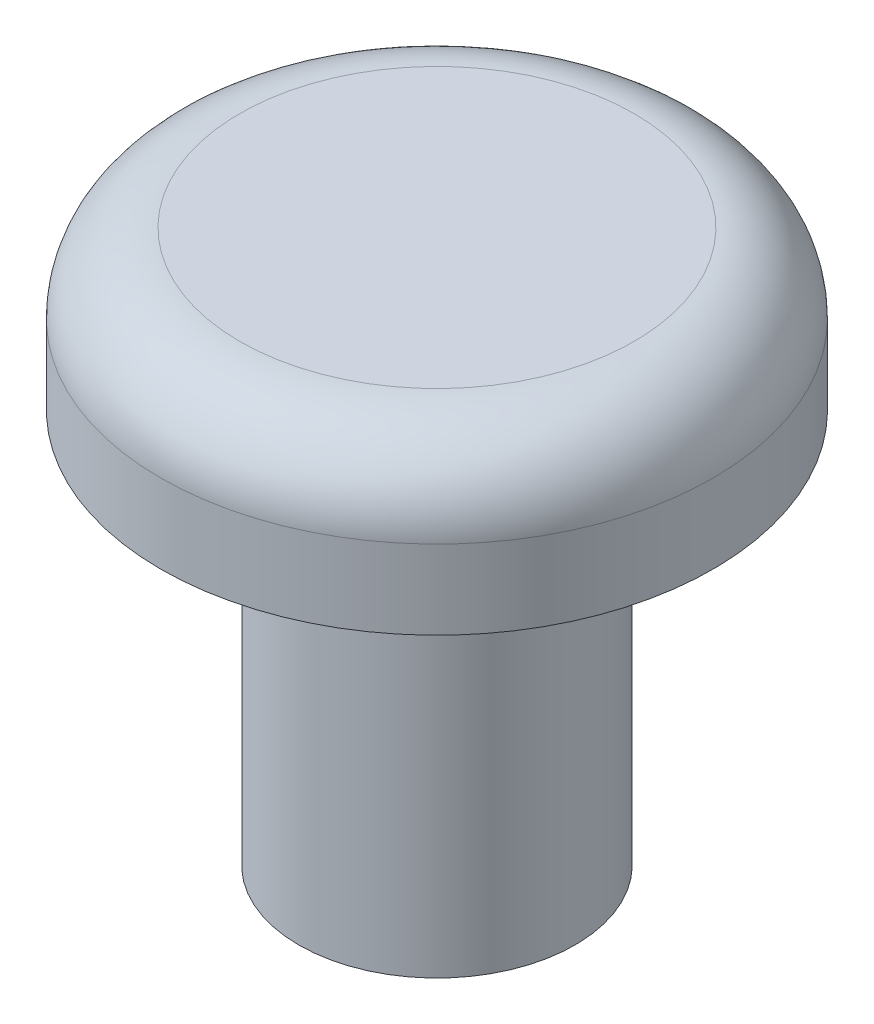
ISO-10303-21;
HEADER;
FILE_DESCRIPTION(('STEP AP214'),'2;1');
FILE_NAME('part.step','',(''),(''),'','','');
FILE_SCHEMA(('AUTOMOTIVE_DESIGN { 1 0 10303 214 1 1 1 1 }'));
ENDSEC;
DATA;
#1=APPLICATION_CONTEXT('core data for automotive mechanical design processes');
#2=APPLICATION_PROTOCOL_DEFINITION('international standard','automotive_design',2000,#1);
#3=PRODUCT_CONTEXT('',#1,'mechanical');
#4=PRODUCT('Part','Part','',(#3));
#5=PRODUCT_RELATED_PRODUCT_CATEGORY('part','',(#4));
#6=PRODUCT_DEFINITION_FORMATION('','',#4);
#7=PRODUCT_DEFINITION_CONTEXT('part definition',#1,'design');
#8=PRODUCT_DEFINITION('design','',#6,#7);
#9=PRODUCT_DEFINITION_SHAPE('','',#8);
#10=(LENGTH_UNIT() NAMED_UNIT(*) SI_UNIT(.MILLI.,.METRE.));
#11=(NAMED_UNIT(*) PLANE_ANGLE_UNIT() SI_UNIT($,.RADIAN.));
#12=(NAMED_UNIT(*) SI_UNIT($,.STERADIAN.) SOLID_ANGLE_UNIT());
#13=UNCERTAINTY_MEASURE_WITH_UNIT(LENGTH_MEASURE(1.E-05),#10,'distance_accuracy_value','');
#14=(GEOMETRIC_REPRESENTATION_CONTEXT(3) GLOBAL_UNCERTAINTY_ASSIGNED_CONTEXT((#13)) GLOBAL_UNIT_ASSIGNED_CONTEXT((#10,
#11,#12)) REPRESENTATION_CONTEXT('',''));
#15=CARTESIAN_POINT('',(0.,0.,0.));
#16=DIRECTION('',(0.,0.,1.));
#17=DIRECTION('',(1.,0.,0.));
#18=AXIS2_PLACEMENT_3D('',#15,#16,#17);
#19=CARTESIAN_POINT('',(0.,5.,0.));
#20=DIRECTION('',(0.,-1.,0.));
#21=DIRECTION('',(0.,0.,-1.));
#22=AXIS2_PLACEMENT_3D('',#19,#20,#21);
#23=CYLINDRICAL_SURFACE('',#22,1.75);
#24=CARTESIAN_POINT('',(0.,5.,0.));
#25=DIRECTION('',(0.,1.,0.));
#26=DIRECTION('',(0.,0.,1.));
#27=AXIS2_PLACEMENT_3D('',#24,#25,#26);
#28=CIRCLE('',#27,1.75);
#29=CARTESIAN_POINT('',(0.,5.,1.75));
#30=VERTEX_POINT('',#29);
#31=EDGE_CURVE('E42',#30,#30,#28,.T.);
#32=ORIENTED_EDGE('',*,*,#31,.F.);
#33=EDGE_LOOP('',(#32));
#34=FACE_BOUND('',#33,.T.);
#35=CARTESIAN_POINT('',(0.,0.,0.));
#36=DIRECTION('',(0.,1.,0.));
#37=DIRECTION('',(0.,0.,1.));
#38=AXIS2_PLACEMENT_3D('',#35,#36,#37);
#39=CIRCLE('',#38,1.75);
#40=CARTESIAN_POINT('',(0.,0.,1.75));
#41=VERTEX_POINT('',#40);
#42=EDGE_CURVE('E46',#41,#41,#39,.T.);
#43=ORIENTED_EDGE('',*,*,#42,.T.);
#44=EDGE_LOOP('',(#43));
#45=FACE_BOUND('',#44,.T.);
#46=ADVANCED_FACE('F31',(#34,#45),#23,.T.);
#47=CARTESIAN_POINT('',(0.,0.,0.));
#48=DIRECTION('',(0.,1.,0.));
#49=DIRECTION('',(0.,0.,1.));
#50=AXIS2_PLACEMENT_3D('',#47,#48,#49);
#51=PLANE('',#50);
#52=ORIENTED_EDGE('',*,*,#42,.F.);
#53=EDGE_LOOP('',(#52));
#54=FACE_BOUND('',#53,.T.);
#55=ADVANCED_FACE('F60',(#54),#51,.F.);
#56=CARTESIAN_POINT('',(0.,5.,0.));
#57=DIRECTION('',(0.,1.,0.));
#58=DIRECTION('',(0.,0.,1.));
#59=AXIS2_PLACEMENT_3D('',#56,#57,#58);
#60=PLANE('',#59);
#61=CARTESIAN_POINT('',(0.,5.,0.));
#62=DIRECTION('',(0.,1.,0.));
#63=DIRECTION('',(0.,0.,1.));
#64=AXIS2_PLACEMENT_3D('',#61,#62,#63);
#65=CIRCLE('',#64,3.5);
#66=CARTESIAN_POINT('',(0.,5.,3.5));
#67=VERTEX_POINT('',#66);
#68=EDGE_CURVE('E50',#67,#67,#65,.T.);
#69=ORIENTED_EDGE('',*,*,#68,.F.);
#70=EDGE_LOOP('',(#69));
#71=FACE_BOUND('',#70,.T.);
#72=ORIENTED_EDGE('',*,*,#31,.T.);
#73=EDGE_LOOP('',(#72));
#74=FACE_BOUND('',#73,.T.);
#75=ADVANCED_FACE('F57',(#71,#74),#60,.F.);
#76=CARTESIAN_POINT('',(0.,7.,0.));
#77=DIRECTION('',(0.,-1.,0.));
#78=DIRECTION('',(0.,0.,-1.));
#79=AXIS2_PLACEMENT_3D('',#76,#77,#78);
#80=CYLINDRICAL_SURFACE('',#79,3.5);
#81=CARTESIAN_POINT('',(0.,6.,0.));
#82=DIRECTION('',(0.,1.,0.));
#83=DIRECTION('',(0.,0.,1.));
#84=AXIS2_PLACEMENT_3D('',#81,#82,#83);
#85=CIRCLE('',#84,3.5);
#86=CARTESIAN_POINT('',(0.,6.,3.5));
#87=VERTEX_POINT('',#86);
#88=EDGE_CURVE('E10',#87,#87,#85,.F.);
#89=ORIENTED_EDGE('',*,*,#88,.T.);
#90=EDGE_LOOP('',(#89));
#91=FACE_BOUND('',#90,.T.);
#92=ORIENTED_EDGE('',*,*,#68,.T.);
#93=EDGE_LOOP('',(#92));
#94=FACE_BOUND('',#93,.T.);
#95=ADVANCED_FACE('F55',(#91,#94),#80,.T.);
#96=CARTESIAN_POINT('',(0.,7.,0.));
#97=DIRECTION('',(0.,1.,0.));
#98=DIRECTION('',(0.,0.,1.));
#99=AXIS2_PLACEMENT_3D('',#96,#97,#98);
#100=PLANE('',#99);
#101=CARTESIAN_POINT('',(0.,7.,0.));
#102=DIRECTION('',(0.,1.,0.));
#103=DIRECTION('',(0.,0.,1.));
#104=AXIS2_PLACEMENT_3D('',#101,#102,#103);
#105=CIRCLE('',#104,2.5);
#106=CARTESIAN_POINT('',(0.,7.,2.5));
#107=VERTEX_POINT('',#106);
#108=EDGE_CURVE('E38',#107,#107,#105,.T.);
#109=ORIENTED_EDGE('',*,*,#108,.T.);
#110=EDGE_LOOP('',(#109));
#111=FACE_BOUND('',#110,.T.);
#112=ADVANCED_FACE('F74',(#111),#100,.T.);
#113=CARTESIAN_POINT('',(0.,6.,0.));
#114=DIRECTION('',(0.,1.,0.));
#115=DIRECTION('',(0.,0.,1.));
#116=AXIS2_PLACEMENT_3D('',#113,#114,#115);
#117=TOROIDAL_SURFACE('',#116,2.5,1.);
#118=ORIENTED_EDGE('',*,*,#88,.F.);
#119=EDGE_LOOP('',(#118));
#120=FACE_BOUND('',#119,.T.);
#121=ORIENTED_EDGE('',*,*,#108,.F.);
#122=EDGE_LOOP('',(#121));
#123=FACE_BOUND('',#122,.T.);
#124=ADVANCED_FACE('F33',(#120,#123),#117,.T.);
#125=CLOSED_SHELL('',(#46,#55,#75,#95,#112,#124));
#126=MANIFOLD_SOLID_BREP('B2',#125);
#127=ADVANCED_BREP_SHAPE_REPRESENTATION('',(#18,#126),#14);
#128=SHAPE_DEFINITION_REPRESENTATION(#9,#127);
ENDSEC;
END-ISO-10303-21;
